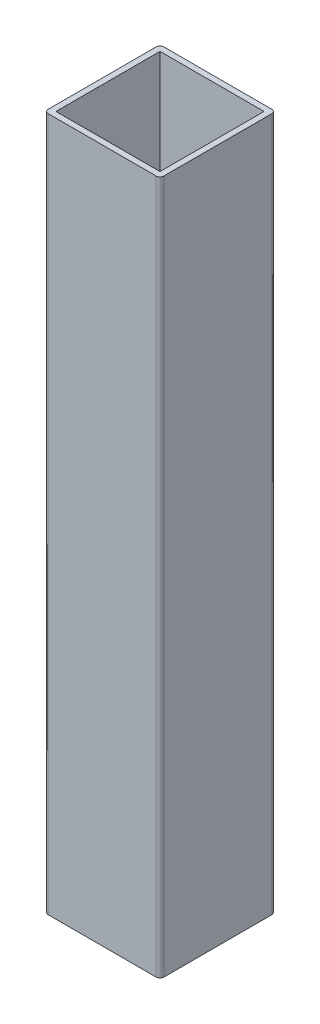
ISO-10303-21;
HEADER;
FILE_DESCRIPTION(('STEP AP214'),'2;1');
FILE_NAME('part.step','',(''),(''),'','','');
FILE_SCHEMA(('AUTOMOTIVE_DESIGN { 1 0 10303 214 1 1 1 1 }'));
ENDSEC;
DATA;
#1=APPLICATION_CONTEXT('core data for automotive mechanical design processes');
#2=APPLICATION_PROTOCOL_DEFINITION('international standard','automotive_design',2000,#1);
#3=PRODUCT_CONTEXT('',#1,'mechanical');
#4=PRODUCT('Part','Part','',(#3));
#5=PRODUCT_RELATED_PRODUCT_CATEGORY('part','',(#4));
#6=PRODUCT_DEFINITION_FORMATION('','',#4);
#7=PRODUCT_DEFINITION_CONTEXT('part definition',#1,'design');
#8=PRODUCT_DEFINITION('design','',#6,#7);
#9=PRODUCT_DEFINITION_SHAPE('','',#8);
#10=(LENGTH_UNIT() NAMED_UNIT(*) SI_UNIT(.MILLI.,.METRE.));
#11=(NAMED_UNIT(*) PLANE_ANGLE_UNIT() SI_UNIT($,.RADIAN.));
#12=(NAMED_UNIT(*) SI_UNIT($,.STERADIAN.) SOLID_ANGLE_UNIT());
#13=UNCERTAINTY_MEASURE_WITH_UNIT(LENGTH_MEASURE(1.E-05),#10,'distance_accuracy_value','');
#14=(GEOMETRIC_REPRESENTATION_CONTEXT(3) GLOBAL_UNCERTAINTY_ASSIGNED_CONTEXT((#13)) GLOBAL_UNIT_ASSIGNED_CONTEXT((#10,
#11,#12)) REPRESENTATION_CONTEXT('',''));
#15=CARTESIAN_POINT('',(0.,0.,0.));
#16=DIRECTION('',(0.,0.,1.));
#17=DIRECTION('',(1.,0.,0.));
#18=AXIS2_PLACEMENT_3D('',#15,#16,#17);
#19=CARTESIAN_POINT('',(-28.,180.,28.));
#20=DIRECTION('',(0.,1.,0.));
#21=DIRECTION('',(0.,0.,1.));
#22=AXIS2_PLACEMENT_3D('',#19,#20,#21);
#23=PLANE('',#22);
#24=CARTESIAN_POINT('',(-28.,180.,28.));
#25=DIRECTION('',(0.,1.,0.));
#26=DIRECTION('',(0.,0.,1.));
#27=AXIS2_PLACEMENT_3D('',#24,#25,#26);
#28=CIRCLE('',#27,2.);
#29=CARTESIAN_POINT('',(-30.,180.,28.));
#30=VERTEX_POINT('',#29);
#31=CARTESIAN_POINT('',(-28.,180.,30.));
#32=VERTEX_POINT('',#31);
#33=EDGE_CURVE('E164',#30,#32,#28,.T.);
#34=ORIENTED_EDGE('',*,*,#33,.T.);
#35=DIRECTION('',(1.,0.,0.));
#36=VECTOR('',#35,1.);
#37=CARTESIAN_POINT('',(-28.,180.,30.));
#38=LINE('',#37,#36);
#39=CARTESIAN_POINT('',(28.,180.,30.));
#40=VERTEX_POINT('',#39);
#41=EDGE_CURVE('E167',#32,#40,#38,.T.);
#42=ORIENTED_EDGE('',*,*,#41,.T.);
#43=CARTESIAN_POINT('',(28.,180.,28.));
#44=DIRECTION('',(0.,1.,0.));
#45=DIRECTION('',(0.,0.,1.));
#46=AXIS2_PLACEMENT_3D('',#43,#44,#45);
#47=CIRCLE('',#46,2.);
#48=CARTESIAN_POINT('',(30.,180.,28.));
#49=VERTEX_POINT('',#48);
#50=EDGE_CURVE('E170',#40,#49,#47,.T.);
#51=ORIENTED_EDGE('',*,*,#50,.T.);
#52=DIRECTION('',(0.,0.,-1.));
#53=VECTOR('',#52,1.);
#54=CARTESIAN_POINT('',(30.,180.,28.));
#55=LINE('',#54,#53);
#56=CARTESIAN_POINT('',(30.,180.,-28.));
#57=VERTEX_POINT('',#56);
#58=EDGE_CURVE('E172',#49,#57,#55,.T.);
#59=ORIENTED_EDGE('',*,*,#58,.T.);
#60=CARTESIAN_POINT('',(28.,180.,-28.));
#61=DIRECTION('',(0.,1.,0.));
#62=DIRECTION('',(0.,0.,-1.));
#63=AXIS2_PLACEMENT_3D('',#60,#61,#62);
#64=CIRCLE('',#63,2.);
#65=CARTESIAN_POINT('',(28.,180.,-30.));
#66=VERTEX_POINT('',#65);
#67=EDGE_CURVE('E174',#57,#66,#64,.T.);
#68=ORIENTED_EDGE('',*,*,#67,.T.);
#69=DIRECTION('',(-1.,0.,0.));
#70=VECTOR('',#69,1.);
#71=CARTESIAN_POINT('',(-28.,180.,-30.));
#72=LINE('',#71,#70);
#73=CARTESIAN_POINT('',(-28.,180.,-30.));
#74=VERTEX_POINT('',#73);
#75=EDGE_CURVE('E176',#66,#74,#72,.T.);
#76=ORIENTED_EDGE('',*,*,#75,.T.);
#77=CARTESIAN_POINT('',(-28.,180.,-28.));
#78=DIRECTION('',(0.,1.,0.));
#79=DIRECTION('',(0.,0.,-1.));
#80=AXIS2_PLACEMENT_3D('',#77,#78,#79);
#81=CIRCLE('',#80,2.);
#82=CARTESIAN_POINT('',(-30.,180.,-28.));
#83=VERTEX_POINT('',#82);
#84=EDGE_CURVE('E178',#74,#83,#81,.T.);
#85=ORIENTED_EDGE('',*,*,#84,.T.);
#86=DIRECTION('',(0.,0.,1.));
#87=VECTOR('',#86,1.);
#88=CARTESIAN_POINT('',(-30.,180.,28.));
#89=LINE('',#88,#87);
#90=EDGE_CURVE('E180',#83,#30,#89,.T.);
#91=ORIENTED_EDGE('',*,*,#90,.T.);
#92=EDGE_LOOP('',(#34,#42,#51,#59,#68,#76,#85,#91));
#93=FACE_BOUND('',#92,.T.);
#94=DIRECTION('',(1.,0.,0.));
#95=VECTOR('',#94,1.);
#96=CARTESIAN_POINT('',(-27.,180.,27.));
#97=LINE('',#96,#95);
#98=CARTESIAN_POINT('',(-27.,180.,27.));
#99=VERTEX_POINT('',#98);
#100=CARTESIAN_POINT('',(27.,180.,27.));
#101=VERTEX_POINT('',#100);
#102=EDGE_CURVE('E136',#99,#101,#97,.T.);
#103=ORIENTED_EDGE('',*,*,#102,.F.);
#104=DIRECTION('',(0.,0.,1.));
#105=VECTOR('',#104,1.);
#106=CARTESIAN_POINT('',(-27.,180.,27.));
#107=LINE('',#106,#105);
#108=CARTESIAN_POINT('',(-27.,180.,-27.));
#109=VERTEX_POINT('',#108);
#110=EDGE_CURVE('E128',#109,#99,#107,.T.);
#111=ORIENTED_EDGE('',*,*,#110,.F.);
#112=DIRECTION('',(-1.,0.,0.));
#113=VECTOR('',#112,1.);
#114=CARTESIAN_POINT('',(-27.,180.,-27.));
#115=LINE('',#114,#113);
#116=CARTESIAN_POINT('',(27.,180.,-27.));
#117=VERTEX_POINT('',#116);
#118=EDGE_CURVE('E150',#117,#109,#115,.T.);
#119=ORIENTED_EDGE('',*,*,#118,.F.);
#120=DIRECTION('',(0.,0.,-1.));
#121=VECTOR('',#120,1.);
#122=CARTESIAN_POINT('',(27.,180.,27.));
#123=LINE('',#122,#121);
#124=EDGE_CURVE('E148',#101,#117,#123,.T.);
#125=ORIENTED_EDGE('',*,*,#124,.F.);
#126=EDGE_LOOP('',(#103,#111,#119,#125));
#127=FACE_BOUND('',#126,.T.);
#128=ADVANCED_FACE('F39',(#93,#127),#23,.T.);
#129=CARTESIAN_POINT('',(-28.,-180.,28.));
#130=DIRECTION('',(0.,1.,0.));
#131=DIRECTION('',(0.,0.,1.));
#132=AXIS2_PLACEMENT_3D('',#129,#130,#131);
#133=PLANE('',#132);
#134=CARTESIAN_POINT('',(-28.,-180.,28.));
#135=DIRECTION('',(0.,1.,0.));
#136=DIRECTION('',(0.,0.,1.));
#137=AXIS2_PLACEMENT_3D('',#134,#135,#136);
#138=CIRCLE('',#137,2.);
#139=CARTESIAN_POINT('',(-30.,-180.,28.));
#140=VERTEX_POINT('',#139);
#141=CARTESIAN_POINT('',(-28.,-180.,30.));
#142=VERTEX_POINT('',#141);
#143=EDGE_CURVE('E144',#140,#142,#138,.T.);
#144=ORIENTED_EDGE('',*,*,#143,.F.);
#145=DIRECTION('',(0.,0.,1.));
#146=VECTOR('',#145,1.);
#147=CARTESIAN_POINT('',(-30.,-180.,28.));
#148=LINE('',#147,#146);
#149=CARTESIAN_POINT('',(-30.,-180.,-28.));
#150=VERTEX_POINT('',#149);
#151=EDGE_CURVE('E168',#150,#140,#148,.T.);
#152=ORIENTED_EDGE('',*,*,#151,.F.);
#153=CARTESIAN_POINT('',(-28.,-180.,-28.));
#154=DIRECTION('',(0.,1.,0.));
#155=DIRECTION('',(0.,0.,-1.));
#156=AXIS2_PLACEMENT_3D('',#153,#154,#155);
#157=CIRCLE('',#156,2.);
#158=CARTESIAN_POINT('',(-28.,-180.,-30.));
#159=VERTEX_POINT('',#158);
#160=EDGE_CURVE('E195',#159,#150,#157,.T.);
#161=ORIENTED_EDGE('',*,*,#160,.F.);
#162=DIRECTION('',(-1.,0.,0.));
#163=VECTOR('',#162,1.);
#164=CARTESIAN_POINT('',(-28.,-180.,-30.));
#165=LINE('',#164,#163);
#166=CARTESIAN_POINT('',(28.,-180.,-30.));
#167=VERTEX_POINT('',#166);
#168=EDGE_CURVE('E193',#167,#159,#165,.T.);
#169=ORIENTED_EDGE('',*,*,#168,.F.);
#170=CARTESIAN_POINT('',(28.,-180.,-28.));
#171=DIRECTION('',(0.,1.,0.));
#172=DIRECTION('',(0.,0.,-1.));
#173=AXIS2_PLACEMENT_3D('',#170,#171,#172);
#174=CIRCLE('',#173,2.);
#175=CARTESIAN_POINT('',(30.,-180.,-28.));
#176=VERTEX_POINT('',#175);
#177=EDGE_CURVE('E191',#176,#167,#174,.T.);
#178=ORIENTED_EDGE('',*,*,#177,.F.);
#179=DIRECTION('',(0.,0.,-1.));
#180=VECTOR('',#179,1.);
#181=CARTESIAN_POINT('',(30.,-180.,28.));
#182=LINE('',#181,#180);
#183=CARTESIAN_POINT('',(30.,-180.,28.));
#184=VERTEX_POINT('',#183);
#185=EDGE_CURVE('E189',#184,#176,#182,.T.);
#186=ORIENTED_EDGE('',*,*,#185,.F.);
#187=CARTESIAN_POINT('',(28.,-180.,28.));
#188=DIRECTION('',(0.,1.,0.));
#189=DIRECTION('',(0.,0.,1.));
#190=AXIS2_PLACEMENT_3D('',#187,#188,#189);
#191=CIRCLE('',#190,2.);
#192=CARTESIAN_POINT('',(28.,-180.,30.));
#193=VERTEX_POINT('',#192);
#194=EDGE_CURVE('E187',#193,#184,#191,.T.);
#195=ORIENTED_EDGE('',*,*,#194,.F.);
#196=DIRECTION('',(1.,0.,0.));
#197=VECTOR('',#196,1.);
#198=CARTESIAN_POINT('',(-28.,-180.,30.));
#199=LINE('',#198,#197);
#200=EDGE_CURVE('E185',#142,#193,#199,.T.);
#201=ORIENTED_EDGE('',*,*,#200,.F.);
#202=EDGE_LOOP('',(#144,#152,#161,#169,#178,#186,#195,#201));
#203=FACE_BOUND('',#202,.T.);
#204=DIRECTION('',(0.,0.,1.));
#205=VECTOR('',#204,1.);
#206=CARTESIAN_POINT('',(-27.,-180.,27.));
#207=LINE('',#206,#205);
#208=CARTESIAN_POINT('',(-27.,-180.,-27.));
#209=VERTEX_POINT('',#208);
#210=CARTESIAN_POINT('',(-27.,-180.,27.));
#211=VERTEX_POINT('',#210);
#212=EDGE_CURVE('E62',#209,#211,#207,.T.);
#213=ORIENTED_EDGE('',*,*,#212,.T.);
#214=DIRECTION('',(1.,0.,0.));
#215=VECTOR('',#214,1.);
#216=CARTESIAN_POINT('',(-27.,-180.,27.));
#217=LINE('',#216,#215);
#218=CARTESIAN_POINT('',(27.,-180.,27.));
#219=VERTEX_POINT('',#218);
#220=EDGE_CURVE('E143',#211,#219,#217,.T.);
#221=ORIENTED_EDGE('',*,*,#220,.T.);
#222=DIRECTION('',(0.,0.,-1.));
#223=VECTOR('',#222,1.);
#224=CARTESIAN_POINT('',(27.,-180.,27.));
#225=LINE('',#224,#223);
#226=CARTESIAN_POINT('',(27.,-180.,-27.));
#227=VERTEX_POINT('',#226);
#228=EDGE_CURVE('E156',#219,#227,#225,.T.);
#229=ORIENTED_EDGE('',*,*,#228,.T.);
#230=DIRECTION('',(-1.,0.,0.));
#231=VECTOR('',#230,1.);
#232=CARTESIAN_POINT('',(-27.,-180.,-27.));
#233=LINE('',#232,#231);
#234=EDGE_CURVE('E137',#227,#209,#233,.T.);
#235=ORIENTED_EDGE('',*,*,#234,.T.);
#236=EDGE_LOOP('',(#213,#221,#229,#235));
#237=FACE_BOUND('',#236,.T.);
#238=ADVANCED_FACE('F225',(#203,#237),#133,.F.);
#239=CARTESIAN_POINT('',(-28.,180.,28.));
#240=DIRECTION('',(0.,-1.,0.));
#241=DIRECTION('',(0.,0.,-1.));
#242=AXIS2_PLACEMENT_3D('',#239,#240,#241);
#243=CYLINDRICAL_SURFACE('',#242,2.);
#244=ORIENTED_EDGE('',*,*,#143,.T.);
#245=DIRECTION('',(0.,-1.,0.));
#246=VECTOR('',#245,1.);
#247=CARTESIAN_POINT('',(-28.,180.,30.));
#248=LINE('',#247,#246);
#249=EDGE_CURVE('E11',#32,#142,#248,.T.);
#250=ORIENTED_EDGE('',*,*,#249,.F.);
#251=ORIENTED_EDGE('',*,*,#33,.F.);
#252=DIRECTION('',(0.,-1.,0.));
#253=VECTOR('',#252,1.);
#254=CARTESIAN_POINT('',(-30.,180.,28.));
#255=LINE('',#254,#253);
#256=EDGE_CURVE('E182',#30,#140,#255,.T.);
#257=ORIENTED_EDGE('',*,*,#256,.T.);
#258=EDGE_LOOP('',(#244,#250,#251,#257));
#259=FACE_BOUND('',#258,.T.);
#260=ADVANCED_FACE('F41',(#259),#243,.T.);
#261=CARTESIAN_POINT('',(-28.,180.,30.));
#262=DIRECTION('',(0.,0.,-1.));
#263=DIRECTION('',(-1.,0.,0.));
#264=AXIS2_PLACEMENT_3D('',#261,#262,#263);
#265=PLANE('',#264);
#266=ORIENTED_EDGE('',*,*,#200,.T.);
#267=DIRECTION('',(0.,-1.,0.));
#268=VECTOR('',#267,1.);
#269=CARTESIAN_POINT('',(28.,180.,30.));
#270=LINE('',#269,#268);
#271=EDGE_CURVE('E47',#40,#193,#270,.T.);
#272=ORIENTED_EDGE('',*,*,#271,.F.);
#273=ORIENTED_EDGE('',*,*,#41,.F.);
#274=ORIENTED_EDGE('',*,*,#249,.T.);
#275=EDGE_LOOP('',(#266,#272,#273,#274));
#276=FACE_BOUND('',#275,.T.);
#277=ADVANCED_FACE('F242',(#276),#265,.F.);
#278=CARTESIAN_POINT('',(28.,180.,28.));
#279=DIRECTION('',(0.,-1.,0.));
#280=DIRECTION('',(0.,0.,-1.));
#281=AXIS2_PLACEMENT_3D('',#278,#279,#280);
#282=CYLINDRICAL_SURFACE('',#281,2.);
#283=ORIENTED_EDGE('',*,*,#194,.T.);
#284=DIRECTION('',(0.,-1.,0.));
#285=VECTOR('',#284,1.);
#286=CARTESIAN_POINT('',(30.,180.,28.));
#287=LINE('',#286,#285);
#288=EDGE_CURVE('E212',#49,#184,#287,.T.);
#289=ORIENTED_EDGE('',*,*,#288,.F.);
#290=ORIENTED_EDGE('',*,*,#50,.F.);
#291=ORIENTED_EDGE('',*,*,#271,.T.);
#292=EDGE_LOOP('',(#283,#289,#290,#291));
#293=FACE_BOUND('',#292,.T.);
#294=ADVANCED_FACE('F219',(#293),#282,.T.);
#295=CARTESIAN_POINT('',(30.,180.,28.));
#296=DIRECTION('',(-1.,0.,0.));
#297=DIRECTION('',(0.,0.,1.));
#298=AXIS2_PLACEMENT_3D('',#295,#296,#297);
#299=PLANE('',#298);
#300=ORIENTED_EDGE('',*,*,#185,.T.);
#301=DIRECTION('',(0.,-1.,0.));
#302=VECTOR('',#301,1.);
#303=CARTESIAN_POINT('',(30.,180.,-28.));
#304=LINE('',#303,#302);
#305=EDGE_CURVE('E209',#57,#176,#304,.T.);
#306=ORIENTED_EDGE('',*,*,#305,.F.);
#307=ORIENTED_EDGE('',*,*,#58,.F.);
#308=ORIENTED_EDGE('',*,*,#288,.T.);
#309=EDGE_LOOP('',(#300,#306,#307,#308));
#310=FACE_BOUND('',#309,.T.);
#311=ADVANCED_FACE('F231',(#310),#299,.F.);
#312=CARTESIAN_POINT('',(28.,180.,-28.));
#313=DIRECTION('',(0.,-1.,0.));
#314=DIRECTION('',(0.,0.,-1.));
#315=AXIS2_PLACEMENT_3D('',#312,#313,#314);
#316=CYLINDRICAL_SURFACE('',#315,2.);
#317=ORIENTED_EDGE('',*,*,#177,.T.);
#318=DIRECTION('',(0.,-1.,0.));
#319=VECTOR('',#318,1.);
#320=CARTESIAN_POINT('',(28.,180.,-30.));
#321=LINE('',#320,#319);
#322=EDGE_CURVE('E206',#66,#167,#321,.T.);
#323=ORIENTED_EDGE('',*,*,#322,.F.);
#324=ORIENTED_EDGE('',*,*,#67,.F.);
#325=ORIENTED_EDGE('',*,*,#305,.T.);
#326=EDGE_LOOP('',(#317,#323,#324,#325));
#327=FACE_BOUND('',#326,.T.);
#328=ADVANCED_FACE('F235',(#327),#316,.T.);
#329=CARTESIAN_POINT('',(-28.,180.,-30.));
#330=DIRECTION('',(0.,0.,1.));
#331=DIRECTION('',(1.,0.,0.));
#332=AXIS2_PLACEMENT_3D('',#329,#330,#331);
#333=PLANE('',#332);
#334=ORIENTED_EDGE('',*,*,#168,.T.);
#335=DIRECTION('',(0.,-1.,0.));
#336=VECTOR('',#335,1.);
#337=CARTESIAN_POINT('',(-28.,180.,-30.));
#338=LINE('',#337,#336);
#339=EDGE_CURVE('E203',#74,#159,#338,.T.);
#340=ORIENTED_EDGE('',*,*,#339,.F.);
#341=ORIENTED_EDGE('',*,*,#75,.F.);
#342=ORIENTED_EDGE('',*,*,#322,.T.);
#343=EDGE_LOOP('',(#334,#340,#341,#342));
#344=FACE_BOUND('',#343,.T.);
#345=ADVANCED_FACE('F255',(#344),#333,.F.);
#346=CARTESIAN_POINT('',(-28.,180.,-28.));
#347=DIRECTION('',(0.,-1.,0.));
#348=DIRECTION('',(0.,0.,-1.));
#349=AXIS2_PLACEMENT_3D('',#346,#347,#348);
#350=CYLINDRICAL_SURFACE('',#349,2.);
#351=ORIENTED_EDGE('',*,*,#160,.T.);
#352=DIRECTION('',(0.,-1.,0.));
#353=VECTOR('',#352,1.);
#354=CARTESIAN_POINT('',(-30.,180.,-28.));
#355=LINE('',#354,#353);
#356=EDGE_CURVE('E200',#83,#150,#355,.T.);
#357=ORIENTED_EDGE('',*,*,#356,.F.);
#358=ORIENTED_EDGE('',*,*,#84,.F.);
#359=ORIENTED_EDGE('',*,*,#339,.T.);
#360=EDGE_LOOP('',(#351,#357,#358,#359));
#361=FACE_BOUND('',#360,.T.);
#362=ADVANCED_FACE('F253',(#361),#350,.T.);
#363=CARTESIAN_POINT('',(-30.,180.,28.));
#364=DIRECTION('',(1.,0.,0.));
#365=DIRECTION('',(0.,0.,-1.));
#366=AXIS2_PLACEMENT_3D('',#363,#364,#365);
#367=PLANE('',#366);
#368=ORIENTED_EDGE('',*,*,#151,.T.);
#369=ORIENTED_EDGE('',*,*,#256,.F.);
#370=ORIENTED_EDGE('',*,*,#90,.F.);
#371=ORIENTED_EDGE('',*,*,#356,.T.);
#372=EDGE_LOOP('',(#368,#369,#370,#371));
#373=FACE_BOUND('',#372,.T.);
#374=ADVANCED_FACE('F248',(#373),#367,.F.);
#375=CARTESIAN_POINT('',(-27.,180.,27.));
#376=DIRECTION('',(1.,0.,0.));
#377=DIRECTION('',(0.,0.,-1.));
#378=AXIS2_PLACEMENT_3D('',#375,#376,#377);
#379=PLANE('',#378);
#380=ORIENTED_EDGE('',*,*,#212,.F.);
#381=DIRECTION('',(0.,-1.,0.));
#382=VECTOR('',#381,1.);
#383=CARTESIAN_POINT('',(-27.,180.,-27.));
#384=LINE('',#383,#382);
#385=EDGE_CURVE('E132',#109,#209,#384,.T.);
#386=ORIENTED_EDGE('',*,*,#385,.F.);
#387=ORIENTED_EDGE('',*,*,#110,.T.);
#388=DIRECTION('',(0.,-1.,0.));
#389=VECTOR('',#388,1.);
#390=CARTESIAN_POINT('',(-27.,180.,27.));
#391=LINE('',#390,#389);
#392=EDGE_CURVE('E131',#99,#211,#391,.T.);
#393=ORIENTED_EDGE('',*,*,#392,.T.);
#394=EDGE_LOOP('',(#380,#386,#387,#393));
#395=FACE_BOUND('',#394,.T.);
#396=ADVANCED_FACE('F130',(#395),#379,.T.);
#397=CARTESIAN_POINT('',(-27.,180.,27.));
#398=DIRECTION('',(0.,0.,-1.));
#399=DIRECTION('',(-1.,0.,0.));
#400=AXIS2_PLACEMENT_3D('',#397,#398,#399);
#401=PLANE('',#400);
#402=ORIENTED_EDGE('',*,*,#220,.F.);
#403=ORIENTED_EDGE('',*,*,#392,.F.);
#404=ORIENTED_EDGE('',*,*,#102,.T.);
#405=DIRECTION('',(0.,-1.,0.));
#406=VECTOR('',#405,1.);
#407=CARTESIAN_POINT('',(27.,180.,27.));
#408=LINE('',#407,#406);
#409=EDGE_CURVE('E145',#101,#219,#408,.T.);
#410=ORIENTED_EDGE('',*,*,#409,.T.);
#411=EDGE_LOOP('',(#402,#403,#404,#410));
#412=FACE_BOUND('',#411,.T.);
#413=ADVANCED_FACE('F140',(#412),#401,.T.);
#414=CARTESIAN_POINT('',(27.,180.,27.));
#415=DIRECTION('',(-1.,0.,0.));
#416=DIRECTION('',(0.,0.,1.));
#417=AXIS2_PLACEMENT_3D('',#414,#415,#416);
#418=PLANE('',#417);
#419=ORIENTED_EDGE('',*,*,#228,.F.);
#420=ORIENTED_EDGE('',*,*,#409,.F.);
#421=ORIENTED_EDGE('',*,*,#124,.T.);
#422=DIRECTION('',(0.,-1.,0.));
#423=VECTOR('',#422,1.);
#424=CARTESIAN_POINT('',(27.,180.,-27.));
#425=LINE('',#424,#423);
#426=EDGE_CURVE('E54',#117,#227,#425,.T.);
#427=ORIENTED_EDGE('',*,*,#426,.T.);
#428=EDGE_LOOP('',(#419,#420,#421,#427));
#429=FACE_BOUND('',#428,.T.);
#430=ADVANCED_FACE('F280',(#429),#418,.T.);
#431=CARTESIAN_POINT('',(-27.,180.,-27.));
#432=DIRECTION('',(0.,0.,1.));
#433=DIRECTION('',(1.,0.,0.));
#434=AXIS2_PLACEMENT_3D('',#431,#432,#433);
#435=PLANE('',#434);
#436=ORIENTED_EDGE('',*,*,#234,.F.);
#437=ORIENTED_EDGE('',*,*,#426,.F.);
#438=ORIENTED_EDGE('',*,*,#118,.T.);
#439=ORIENTED_EDGE('',*,*,#385,.T.);
#440=EDGE_LOOP('',(#436,#437,#438,#439));
#441=FACE_BOUND('',#440,.T.);
#442=ADVANCED_FACE('F284',(#441),#435,.T.);
#443=CLOSED_SHELL('',(#128,#238,#260,#277,#294,#311,#328,#345,#362,#374,#396,#413,#430,#442));
#444=MANIFOLD_SOLID_BREP('B2',#443);
#445=ADVANCED_BREP_SHAPE_REPRESENTATION('',(#18,#444),#14);
#446=SHAPE_DEFINITION_REPRESENTATION(#9,#445);
ENDSEC;
END-ISO-10303-21;
